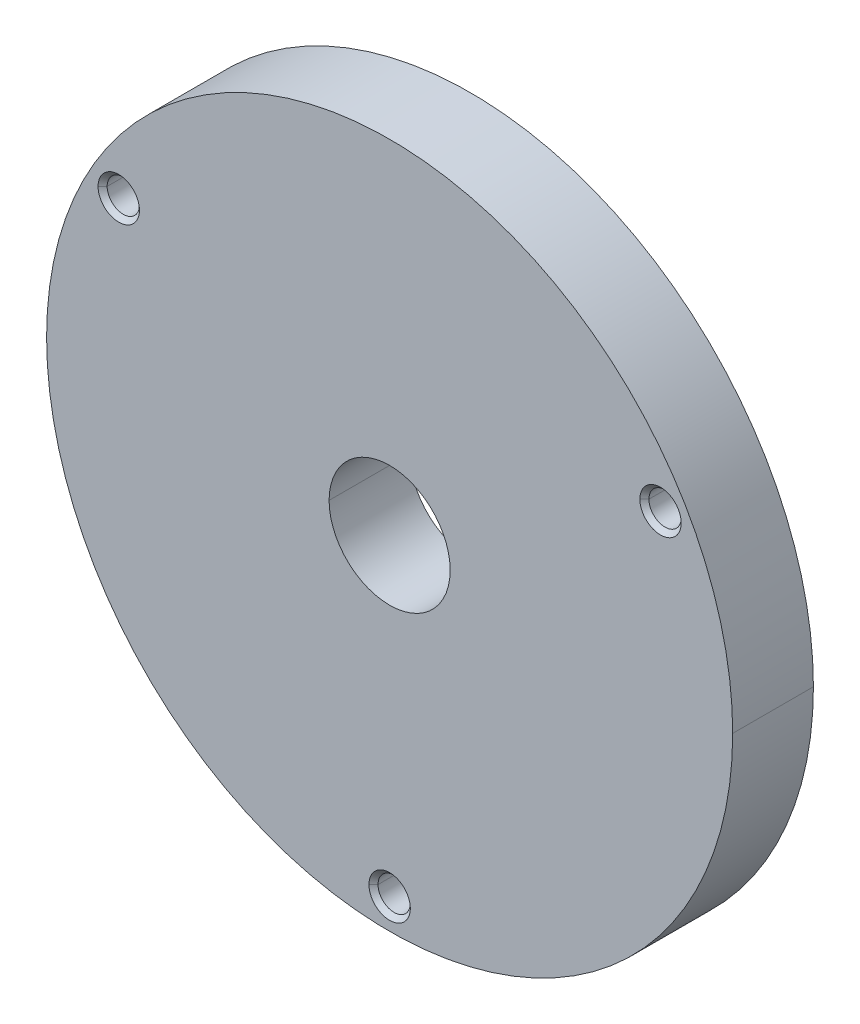
ISO-10303-21;
HEADER;
FILE_DESCRIPTION(('STEP AP214'),'2;1');
FILE_NAME('part.step','',(''),(''),'','','');
FILE_SCHEMA(('AUTOMOTIVE_DESIGN { 1 0 10303 214 1 1 1 1 }'));
ENDSEC;
DATA;
#1=APPLICATION_CONTEXT('core data for automotive mechanical design processes');
#2=APPLICATION_PROTOCOL_DEFINITION('international standard','automotive_design',2000,#1);
#3=PRODUCT_CONTEXT('',#1,'mechanical');
#4=PRODUCT('Part','Part','',(#3));
#5=PRODUCT_RELATED_PRODUCT_CATEGORY('part','',(#4));
#6=PRODUCT_DEFINITION_FORMATION('','',#4);
#7=PRODUCT_DEFINITION_CONTEXT('part definition',#1,'design');
#8=PRODUCT_DEFINITION('design','',#6,#7);
#9=PRODUCT_DEFINITION_SHAPE('','',#8);
#10=(LENGTH_UNIT() NAMED_UNIT(*) SI_UNIT(.MILLI.,.METRE.));
#11=(NAMED_UNIT(*) PLANE_ANGLE_UNIT() SI_UNIT($,.RADIAN.));
#12=(NAMED_UNIT(*) SI_UNIT($,.STERADIAN.) SOLID_ANGLE_UNIT());
#13=UNCERTAINTY_MEASURE_WITH_UNIT(LENGTH_MEASURE(1.E-05),#10,'distance_accuracy_value','');
#14=(GEOMETRIC_REPRESENTATION_CONTEXT(3) GLOBAL_UNCERTAINTY_ASSIGNED_CONTEXT((#13)) GLOBAL_UNIT_ASSIGNED_CONTEXT((#10,
#11,#12)) REPRESENTATION_CONTEXT('',''));
#15=CARTESIAN_POINT('',(0.,0.,0.));
#16=DIRECTION('',(0.,0.,1.));
#17=DIRECTION('',(1.,0.,0.));
#18=AXIS2_PLACEMENT_3D('',#15,#16,#17);
#19=CARTESIAN_POINT('',(0.,0.,-4.));
#20=DIRECTION('',(0.,0.,1.));
#21=DIRECTION('',(1.,0.,0.));
#22=AXIS2_PLACEMENT_3D('',#19,#20,#21);
#23=CYLINDRICAL_SURFACE('',#22,3.);
#24=DIRECTION('',(0.,0.,1.));
#25=VECTOR('',#24,1.);
#26=CARTESIAN_POINT('',(-3.,0.,-4.));
#27=LINE('',#26,#25);
#28=CARTESIAN_POINT('',(-3.,0.,-4.));
#29=VERTEX_POINT('',#28);
#30=CARTESIAN_POINT('',(-3.,0.,0.));
#31=VERTEX_POINT('',#30);
#32=EDGE_CURVE('E228',#29,#31,#27,.T.);
#33=ORIENTED_EDGE('',*,*,#32,.F.);
#34=CARTESIAN_POINT('',(0.,0.,-4.));
#35=DIRECTION('',(0.,0.,1.));
#36=DIRECTION('',(1.,0.,0.));
#37=AXIS2_PLACEMENT_3D('',#34,#35,#36);
#38=CIRCLE('',#37,3.);
#39=CARTESIAN_POINT('',(3.,0.,-4.));
#40=VERTEX_POINT('',#39);
#41=EDGE_CURVE('E82',#40,#29,#38,.T.);
#42=ORIENTED_EDGE('',*,*,#41,.F.);
#43=DIRECTION('',(0.,0.,1.));
#44=VECTOR('',#43,1.);
#45=CARTESIAN_POINT('',(3.,0.,-4.));
#46=LINE('',#45,#44);
#47=CARTESIAN_POINT('',(3.,0.,0.));
#48=VERTEX_POINT('',#47);
#49=EDGE_CURVE('E204',#40,#48,#46,.T.);
#50=ORIENTED_EDGE('',*,*,#49,.T.);
#51=CARTESIAN_POINT('',(0.,0.,0.));
#52=DIRECTION('',(0.,0.,1.));
#53=DIRECTION('',(1.,0.,0.));
#54=AXIS2_PLACEMENT_3D('',#51,#52,#53);
#55=CIRCLE('',#54,3.);
#56=EDGE_CURVE('E171',#48,#31,#55,.T.);
#57=ORIENTED_EDGE('',*,*,#56,.T.);
#58=EDGE_LOOP('',(#33,#42,#50,#57));
#59=FACE_BOUND('',#58,.T.);
#60=ADVANCED_FACE('F17',(#59),#23,.F.);
#61=CARTESIAN_POINT('',(-13.4233937586589,7.74999999999987,0.));
#62=DIRECTION('',(0.,0.,1.));
#63=DIRECTION('',(1.,0.,0.));
#64=AXIS2_PLACEMENT_3D('',#61,#62,#63);
#65=CONICAL_SURFACE('',#64,1.025,0.785398163397446);
#66=DIRECTION('',(-0.707106781186546,0.,0.707106781186549));
#67=VECTOR('',#66,1.);
#68=CARTESIAN_POINT('',(-14.4483937586589,7.74999999999987,0.));
#69=LINE('',#68,#67);
#70=CARTESIAN_POINT('',(-14.2233937586589,7.74999999999987,-0.225));
#71=VERTEX_POINT('',#70);
#72=CARTESIAN_POINT('',(-14.4483937586589,7.74999999999987,0.));
#73=VERTEX_POINT('',#72);
#74=EDGE_CURVE('E194',#71,#73,#69,.T.);
#75=ORIENTED_EDGE('',*,*,#74,.F.);
#76=CARTESIAN_POINT('',(-13.4233937586589,7.74999999999987,-0.225));
#77=DIRECTION('',(0.,0.,1.));
#78=DIRECTION('',(1.,0.,0.));
#79=AXIS2_PLACEMENT_3D('',#76,#77,#78);
#80=CIRCLE('',#79,0.8);
#81=CARTESIAN_POINT('',(-12.6233937586589,7.74999999999987,-0.225));
#82=VERTEX_POINT('',#81);
#83=EDGE_CURVE('E11',#82,#71,#80,.T.);
#84=ORIENTED_EDGE('',*,*,#83,.F.);
#85=DIRECTION('',(0.707106781186546,0.,0.707106781186549));
#86=VECTOR('',#85,1.);
#87=CARTESIAN_POINT('',(-12.3983937586589,7.74999999999987,0.));
#88=LINE('',#87,#86);
#89=CARTESIAN_POINT('',(-12.3983937586589,7.74999999999987,0.));
#90=VERTEX_POINT('',#89);
#91=EDGE_CURVE('E202',#82,#90,#88,.T.);
#92=ORIENTED_EDGE('',*,*,#91,.T.);
#93=CARTESIAN_POINT('',(-13.4233937586589,7.74999999999987,0.));
#94=DIRECTION('',(0.,0.,1.));
#95=DIRECTION('',(1.,0.,0.));
#96=AXIS2_PLACEMENT_3D('',#93,#94,#95);
#97=CIRCLE('',#96,1.025);
#98=EDGE_CURVE('E160',#90,#73,#97,.T.);
#99=ORIENTED_EDGE('',*,*,#98,.T.);
#100=EDGE_LOOP('',(#75,#84,#92,#99));
#101=FACE_BOUND('',#100,.T.);
#102=ADVANCED_FACE('F195',(#101),#65,.F.);
#103=CARTESIAN_POINT('',(-13.4233937586589,7.74999999999987,0.));
#104=DIRECTION('',(0.,0.,1.));
#105=DIRECTION('',(1.,0.,0.));
#106=AXIS2_PLACEMENT_3D('',#103,#104,#105);
#107=CYLINDRICAL_SURFACE('',#106,0.8);
#108=DIRECTION('',(0.,0.,1.));
#109=VECTOR('',#108,1.);
#110=CARTESIAN_POINT('',(-14.2233937586589,7.74999999999987,0.));
#111=LINE('',#110,#109);
#112=CARTESIAN_POINT('',(-14.2233937586589,7.74999999999987,-4.));
#113=VERTEX_POINT('',#112);
#114=EDGE_CURVE('E178',#113,#71,#111,.T.);
#115=ORIENTED_EDGE('',*,*,#114,.F.);
#116=CARTESIAN_POINT('',(-13.4233937586589,7.74999999999987,-4.));
#117=DIRECTION('',(0.,0.,1.));
#118=DIRECTION('',(1.,0.,0.));
#119=AXIS2_PLACEMENT_3D('',#116,#117,#118);
#120=CIRCLE('',#119,0.799999999999987);
#121=CARTESIAN_POINT('',(-12.6233937586589,7.74999999999987,-4.));
#122=VERTEX_POINT('',#121);
#123=EDGE_CURVE('E148',#122,#113,#120,.T.);
#124=ORIENTED_EDGE('',*,*,#123,.F.);
#125=DIRECTION('',(0.,0.,1.));
#126=VECTOR('',#125,1.);
#127=CARTESIAN_POINT('',(-12.6233937586589,7.74999999999987,0.));
#128=LINE('',#127,#126);
#129=EDGE_CURVE('E181',#122,#82,#128,.T.);
#130=ORIENTED_EDGE('',*,*,#129,.T.);
#131=ORIENTED_EDGE('',*,*,#83,.T.);
#132=EDGE_LOOP('',(#115,#124,#130,#131));
#133=FACE_BOUND('',#132,.T.);
#134=ADVANCED_FACE('F19',(#133),#107,.F.);
#135=CARTESIAN_POINT('',(13.4233937586588,7.75,0.));
#136=DIRECTION('',(0.,0.,1.));
#137=DIRECTION('',(1.,0.,0.));
#138=AXIS2_PLACEMENT_3D('',#135,#136,#137);
#139=CONICAL_SURFACE('',#138,1.025,0.785398163397446);
#140=DIRECTION('',(-0.707106781186546,0.,0.707106781186549));
#141=VECTOR('',#140,1.);
#142=CARTESIAN_POINT('',(12.3983937586588,7.75,0.));
#143=LINE('',#142,#141);
#144=CARTESIAN_POINT('',(12.6233937586588,7.75,-0.225));
#145=VERTEX_POINT('',#144);
#146=CARTESIAN_POINT('',(12.3983937586588,7.75,0.));
#147=VERTEX_POINT('',#146);
#148=EDGE_CURVE('E227',#145,#147,#143,.T.);
#149=ORIENTED_EDGE('',*,*,#148,.F.);
#150=CARTESIAN_POINT('',(13.4233937586588,7.75,-0.225));
#151=DIRECTION('',(0.,0.,1.));
#152=DIRECTION('',(1.,0.,0.));
#153=AXIS2_PLACEMENT_3D('',#150,#151,#152);
#154=CIRCLE('',#153,0.8);
#155=CARTESIAN_POINT('',(14.2233937586588,7.75,-0.225));
#156=VERTEX_POINT('',#155);
#157=EDGE_CURVE('E21',#156,#145,#154,.T.);
#158=ORIENTED_EDGE('',*,*,#157,.F.);
#159=DIRECTION('',(0.707106781186546,0.,0.707106781186549));
#160=VECTOR('',#159,1.);
#161=CARTESIAN_POINT('',(14.4483937586588,7.75,0.));
#162=LINE('',#161,#160);
#163=CARTESIAN_POINT('',(14.4483937586588,7.75,0.));
#164=VERTEX_POINT('',#163);
#165=EDGE_CURVE('E226',#156,#164,#162,.T.);
#166=ORIENTED_EDGE('',*,*,#165,.T.);
#167=CARTESIAN_POINT('',(13.4233937586588,7.75,0.));
#168=DIRECTION('',(0.,0.,1.));
#169=DIRECTION('',(1.,0.,0.));
#170=AXIS2_PLACEMENT_3D('',#167,#168,#169);
#171=CIRCLE('',#170,1.025);
#172=EDGE_CURVE('E218',#164,#147,#171,.T.);
#173=ORIENTED_EDGE('',*,*,#172,.T.);
#174=EDGE_LOOP('',(#149,#158,#166,#173));
#175=FACE_BOUND('',#174,.T.);
#176=ADVANCED_FACE('F334',(#175),#139,.F.);
#177=CARTESIAN_POINT('',(13.4233937586588,7.75,0.));
#178=DIRECTION('',(0.,0.,1.));
#179=DIRECTION('',(1.,0.,0.));
#180=AXIS2_PLACEMENT_3D('',#177,#178,#179);
#181=CYLINDRICAL_SURFACE('',#180,0.8);
#182=DIRECTION('',(0.,0.,1.));
#183=VECTOR('',#182,1.);
#184=CARTESIAN_POINT('',(12.6233937586588,7.75,0.));
#185=LINE('',#184,#183);
#186=CARTESIAN_POINT('',(12.6233937586588,7.75,-4.));
#187=VERTEX_POINT('',#186);
#188=EDGE_CURVE('E233',#187,#145,#185,.T.);
#189=ORIENTED_EDGE('',*,*,#188,.F.);
#190=CARTESIAN_POINT('',(13.4233937586588,7.75,-4.));
#191=DIRECTION('',(0.,0.,1.));
#192=DIRECTION('',(1.,0.,0.));
#193=AXIS2_PLACEMENT_3D('',#190,#191,#192);
#194=CIRCLE('',#193,0.799999999999987);
#195=CARTESIAN_POINT('',(14.2233937586587,7.75,-4.));
#196=VERTEX_POINT('',#195);
#197=EDGE_CURVE('E129',#196,#187,#194,.T.);
#198=ORIENTED_EDGE('',*,*,#197,.F.);
#199=DIRECTION('',(0.,0.,1.));
#200=VECTOR('',#199,1.);
#201=CARTESIAN_POINT('',(14.2233937586588,7.75,0.));
#202=LINE('',#201,#200);
#203=EDGE_CURVE('E237',#196,#156,#202,.T.);
#204=ORIENTED_EDGE('',*,*,#203,.T.);
#205=ORIENTED_EDGE('',*,*,#157,.T.);
#206=EDGE_LOOP('',(#189,#198,#204,#205));
#207=FACE_BOUND('',#206,.T.);
#208=ADVANCED_FACE('F328',(#207),#181,.F.);
#209=CARTESIAN_POINT('',(0.,-15.5,0.));
#210=DIRECTION('',(0.,0.,1.));
#211=DIRECTION('',(1.,0.,0.));
#212=AXIS2_PLACEMENT_3D('',#209,#210,#211);
#213=CONICAL_SURFACE('',#212,1.025,0.785398163397445);
#214=DIRECTION('',(-0.707106781186545,0.,0.70710678118655));
#215=VECTOR('',#214,1.);
#216=CARTESIAN_POINT('',(-1.025,-15.5,0.));
#217=LINE('',#216,#215);
#218=CARTESIAN_POINT('',(-0.8,-15.5,-0.225));
#219=VERTEX_POINT('',#218);
#220=CARTESIAN_POINT('',(-1.025,-15.5,0.));
#221=VERTEX_POINT('',#220);
#222=EDGE_CURVE('E244',#219,#221,#217,.T.);
#223=ORIENTED_EDGE('',*,*,#222,.F.);
#224=CARTESIAN_POINT('',(0.,-15.5,-0.225));
#225=DIRECTION('',(0.,0.,1.));
#226=DIRECTION('',(1.,0.,0.));
#227=AXIS2_PLACEMENT_3D('',#224,#225,#226);
#228=CIRCLE('',#227,0.8);
#229=CARTESIAN_POINT('',(0.8,-15.5,-0.225));
#230=VERTEX_POINT('',#229);
#231=EDGE_CURVE('E257',#230,#219,#228,.T.);
#232=ORIENTED_EDGE('',*,*,#231,.F.);
#233=DIRECTION('',(0.707106781186545,0.,0.70710678118655));
#234=VECTOR('',#233,1.);
#235=CARTESIAN_POINT('',(1.025,-15.5,0.));
#236=LINE('',#235,#234);
#237=CARTESIAN_POINT('',(1.025,-15.5,0.));
#238=VERTEX_POINT('',#237);
#239=EDGE_CURVE('E243',#230,#238,#236,.T.);
#240=ORIENTED_EDGE('',*,*,#239,.T.);
#241=CARTESIAN_POINT('',(0.,-15.5,0.));
#242=DIRECTION('',(0.,0.,1.));
#243=DIRECTION('',(1.,0.,0.));
#244=AXIS2_PLACEMENT_3D('',#241,#242,#243);
#245=CIRCLE('',#244,1.025);
#246=EDGE_CURVE('E221',#238,#221,#245,.T.);
#247=ORIENTED_EDGE('',*,*,#246,.T.);
#248=EDGE_LOOP('',(#223,#232,#240,#247));
#249=FACE_BOUND('',#248,.T.);
#250=ADVANCED_FACE('F359',(#249),#213,.F.);
#251=CARTESIAN_POINT('',(0.,-15.5,0.));
#252=DIRECTION('',(0.,0.,1.));
#253=DIRECTION('',(1.,0.,0.));
#254=AXIS2_PLACEMENT_3D('',#251,#252,#253);
#255=CYLINDRICAL_SURFACE('',#254,0.8);
#256=DIRECTION('',(0.,0.,1.));
#257=VECTOR('',#256,1.);
#258=CARTESIAN_POINT('',(-0.799999999999991,-15.5,0.));
#259=LINE('',#258,#257);
#260=CARTESIAN_POINT('',(-0.799999999999985,-15.5,-4.));
#261=VERTEX_POINT('',#260);
#262=EDGE_CURVE('E267',#261,#219,#259,.T.);
#263=ORIENTED_EDGE('',*,*,#262,.F.);
#264=CARTESIAN_POINT('',(0.,-15.5,-4.));
#265=DIRECTION('',(0.,0.,1.));
#266=DIRECTION('',(1.,0.,0.));
#267=AXIS2_PLACEMENT_3D('',#264,#265,#266);
#268=CIRCLE('',#267,0.799999999999987);
#269=CARTESIAN_POINT('',(0.799999999999989,-15.5,-4.));
#270=VERTEX_POINT('',#269);
#271=EDGE_CURVE('E217',#270,#261,#268,.T.);
#272=ORIENTED_EDGE('',*,*,#271,.F.);
#273=DIRECTION('',(0.,0.,1.));
#274=VECTOR('',#273,1.);
#275=CARTESIAN_POINT('',(0.8,-15.5,0.));
#276=LINE('',#275,#274);
#277=EDGE_CURVE('E268',#270,#230,#276,.T.);
#278=ORIENTED_EDGE('',*,*,#277,.T.);
#279=ORIENTED_EDGE('',*,*,#231,.T.);
#280=EDGE_LOOP('',(#263,#272,#278,#279));
#281=FACE_BOUND('',#280,.T.);
#282=ADVANCED_FACE('F348',(#281),#255,.F.);
#283=CARTESIAN_POINT('',(0.,0.,0.));
#284=DIRECTION('',(0.,0.,1.));
#285=DIRECTION('',(1.,0.,0.));
#286=AXIS2_PLACEMENT_3D('',#283,#284,#285);
#287=PLANE('',#286);
#288=ORIENTED_EDGE('',*,*,#246,.F.);
#289=CARTESIAN_POINT('',(0.,-15.5,0.));
#290=DIRECTION('',(0.,0.,1.));
#291=DIRECTION('',(1.,0.,0.));
#292=AXIS2_PLACEMENT_3D('',#289,#290,#291);
#293=CIRCLE('',#292,1.025);
#294=EDGE_CURVE('E239',#221,#238,#293,.T.);
#295=ORIENTED_EDGE('',*,*,#294,.F.);
#296=EDGE_LOOP('',(#288,#295));
#297=FACE_BOUND('',#296,.T.);
#298=ORIENTED_EDGE('',*,*,#172,.F.);
#299=CARTESIAN_POINT('',(13.4233937586588,7.75,0.));
#300=DIRECTION('',(0.,0.,1.));
#301=DIRECTION('',(1.,0.,0.));
#302=AXIS2_PLACEMENT_3D('',#299,#300,#301);
#303=CIRCLE('',#302,1.025);
#304=EDGE_CURVE('E222',#147,#164,#303,.T.);
#305=ORIENTED_EDGE('',*,*,#304,.F.);
#306=EDGE_LOOP('',(#298,#305));
#307=FACE_BOUND('',#306,.T.);
#308=ORIENTED_EDGE('',*,*,#98,.F.);
#309=CARTESIAN_POINT('',(-13.4233937586589,7.74999999999987,0.));
#310=DIRECTION('',(0.,0.,1.));
#311=DIRECTION('',(1.,0.,0.));
#312=AXIS2_PLACEMENT_3D('',#309,#310,#311);
#313=CIRCLE('',#312,1.025);
#314=EDGE_CURVE('E199',#73,#90,#313,.T.);
#315=ORIENTED_EDGE('',*,*,#314,.F.);
#316=EDGE_LOOP('',(#308,#315));
#317=FACE_BOUND('',#316,.T.);
#318=ORIENTED_EDGE('',*,*,#56,.F.);
#319=CARTESIAN_POINT('',(0.,0.,0.));
#320=DIRECTION('',(0.,0.,1.));
#321=DIRECTION('',(1.,0.,0.));
#322=AXIS2_PLACEMENT_3D('',#319,#320,#321);
#323=CIRCLE('',#322,3.);
#324=EDGE_CURVE('E211',#31,#48,#323,.T.);
#325=ORIENTED_EDGE('',*,*,#324,.F.);
#326=EDGE_LOOP('',(#318,#325));
#327=FACE_BOUND('',#326,.T.);
#328=CARTESIAN_POINT('',(0.,0.,0.));
#329=DIRECTION('',(0.,0.,1.));
#330=DIRECTION('',(1.,0.,0.));
#331=AXIS2_PLACEMENT_3D('',#328,#329,#330);
#332=CIRCLE('',#331,17.);
#333=CARTESIAN_POINT('',(17.,0.,0.));
#334=VERTEX_POINT('',#333);
#335=CARTESIAN_POINT('',(-17.,0.,0.));
#336=VERTEX_POINT('',#335);
#337=EDGE_CURVE('E275',#334,#336,#332,.T.);
#338=ORIENTED_EDGE('',*,*,#337,.T.);
#339=CARTESIAN_POINT('',(0.,0.,0.));
#340=DIRECTION('',(0.,0.,1.));
#341=DIRECTION('',(1.,0.,0.));
#342=AXIS2_PLACEMENT_3D('',#339,#340,#341);
#343=CIRCLE('',#342,17.);
#344=EDGE_CURVE('E41',#336,#334,#343,.T.);
#345=ORIENTED_EDGE('',*,*,#344,.T.);
#346=EDGE_LOOP('',(#338,#345));
#347=FACE_BOUND('',#346,.T.);
#348=ADVANCED_FACE('F343',(#297,#307,#317,#327,#347),#287,.T.);
#349=CARTESIAN_POINT('',(0.,0.,-4.));
#350=DIRECTION('',(0.,0.,1.));
#351=DIRECTION('',(1.,0.,0.));
#352=AXIS2_PLACEMENT_3D('',#349,#350,#351);
#353=PLANE('',#352);
#354=ORIENTED_EDGE('',*,*,#271,.T.);
#355=CARTESIAN_POINT('',(0.,-15.5,-4.));
#356=DIRECTION('',(0.,0.,1.));
#357=DIRECTION('',(1.,0.,0.));
#358=AXIS2_PLACEMENT_3D('',#355,#356,#357);
#359=CIRCLE('',#358,0.799999999999987);
#360=EDGE_CURVE('E263',#261,#270,#359,.T.);
#361=ORIENTED_EDGE('',*,*,#360,.T.);
#362=EDGE_LOOP('',(#354,#361));
#363=FACE_BOUND('',#362,.T.);
#364=ORIENTED_EDGE('',*,*,#197,.T.);
#365=CARTESIAN_POINT('',(13.4233937586588,7.75,-4.));
#366=DIRECTION('',(0.,0.,1.));
#367=DIRECTION('',(1.,0.,0.));
#368=AXIS2_PLACEMENT_3D('',#365,#366,#367);
#369=CIRCLE('',#368,0.799999999999987);
#370=EDGE_CURVE('E238',#187,#196,#369,.T.);
#371=ORIENTED_EDGE('',*,*,#370,.T.);
#372=EDGE_LOOP('',(#364,#371));
#373=FACE_BOUND('',#372,.T.);
#374=ORIENTED_EDGE('',*,*,#123,.T.);
#375=CARTESIAN_POINT('',(-13.4233937586589,7.74999999999987,-4.));
#376=DIRECTION('',(0.,0.,1.));
#377=DIRECTION('',(1.,0.,0.));
#378=AXIS2_PLACEMENT_3D('',#375,#376,#377);
#379=CIRCLE('',#378,0.799999999999987);
#380=EDGE_CURVE('E190',#113,#122,#379,.T.);
#381=ORIENTED_EDGE('',*,*,#380,.T.);
#382=EDGE_LOOP('',(#374,#381));
#383=FACE_BOUND('',#382,.T.);
#384=ORIENTED_EDGE('',*,*,#41,.T.);
#385=CARTESIAN_POINT('',(0.,0.,-4.));
#386=DIRECTION('',(0.,0.,1.));
#387=DIRECTION('',(1.,0.,0.));
#388=AXIS2_PLACEMENT_3D('',#385,#386,#387);
#389=CIRCLE('',#388,3.);
#390=EDGE_CURVE('E231',#29,#40,#389,.T.);
#391=ORIENTED_EDGE('',*,*,#390,.T.);
#392=EDGE_LOOP('',(#384,#391));
#393=FACE_BOUND('',#392,.T.);
#394=CARTESIAN_POINT('',(0.,0.,-4.));
#395=DIRECTION('',(0.,0.,1.));
#396=DIRECTION('',(1.,0.,0.));
#397=AXIS2_PLACEMENT_3D('',#394,#395,#396);
#398=CIRCLE('',#397,17.);
#399=CARTESIAN_POINT('',(17.,0.,-4.));
#400=VERTEX_POINT('',#399);
#401=CARTESIAN_POINT('',(-17.,0.,-4.));
#402=VERTEX_POINT('',#401);
#403=EDGE_CURVE('E272',#400,#402,#398,.T.);
#404=ORIENTED_EDGE('',*,*,#403,.F.);
#405=CARTESIAN_POINT('',(0.,0.,-4.));
#406=DIRECTION('',(0.,0.,1.));
#407=DIRECTION('',(1.,0.,0.));
#408=AXIS2_PLACEMENT_3D('',#405,#406,#407);
#409=CIRCLE('',#408,17.);
#410=EDGE_CURVE('E247',#402,#400,#409,.T.);
#411=ORIENTED_EDGE('',*,*,#410,.F.);
#412=EDGE_LOOP('',(#404,#411));
#413=FACE_BOUND('',#412,.T.);
#414=ADVANCED_FACE('F322',(#363,#373,#383,#393,#413),#353,.F.);
#415=CARTESIAN_POINT('',(0.,0.,-4.));
#416=DIRECTION('',(0.,0.,1.));
#417=DIRECTION('',(1.,0.,0.));
#418=AXIS2_PLACEMENT_3D('',#415,#416,#417);
#419=CYLINDRICAL_SURFACE('',#418,17.);
#420=DIRECTION('',(0.,0.,1.));
#421=VECTOR('',#420,1.);
#422=CARTESIAN_POINT('',(-17.,0.,-4.));
#423=LINE('',#422,#421);
#424=EDGE_CURVE('E281',#402,#336,#423,.T.);
#425=ORIENTED_EDGE('',*,*,#424,.F.);
#426=ORIENTED_EDGE('',*,*,#410,.T.);
#427=DIRECTION('',(0.,0.,1.));
#428=VECTOR('',#427,1.);
#429=CARTESIAN_POINT('',(17.,0.,-4.));
#430=LINE('',#429,#428);
#431=EDGE_CURVE('E250',#400,#334,#430,.T.);
#432=ORIENTED_EDGE('',*,*,#431,.T.);
#433=ORIENTED_EDGE('',*,*,#344,.F.);
#434=EDGE_LOOP('',(#425,#426,#432,#433));
#435=FACE_BOUND('',#434,.T.);
#436=ADVANCED_FACE('F378',(#435),#419,.T.);
#437=CARTESIAN_POINT('',(0.,0.,-4.));
#438=DIRECTION('',(0.,0.,1.));
#439=DIRECTION('',(1.,0.,0.));
#440=AXIS2_PLACEMENT_3D('',#437,#438,#439);
#441=CYLINDRICAL_SURFACE('',#440,17.);
#442=ORIENTED_EDGE('',*,*,#403,.T.);
#443=ORIENTED_EDGE('',*,*,#424,.T.);
#444=ORIENTED_EDGE('',*,*,#337,.F.);
#445=ORIENTED_EDGE('',*,*,#431,.F.);
#446=EDGE_LOOP('',(#442,#443,#444,#445));
#447=FACE_BOUND('',#446,.T.);
#448=ADVANCED_FACE('F372',(#447),#441,.T.);
#449=CARTESIAN_POINT('',(0.,-15.5,0.));
#450=DIRECTION('',(0.,0.,1.));
#451=DIRECTION('',(1.,0.,0.));
#452=AXIS2_PLACEMENT_3D('',#449,#450,#451);
#453=CYLINDRICAL_SURFACE('',#452,0.8);
#454=ORIENTED_EDGE('',*,*,#360,.F.);
#455=ORIENTED_EDGE('',*,*,#262,.T.);
#456=CARTESIAN_POINT('',(0.,-15.5,-0.225));
#457=DIRECTION('',(0.,0.,1.));
#458=DIRECTION('',(1.,0.,0.));
#459=AXIS2_PLACEMENT_3D('',#456,#457,#458);
#460=CIRCLE('',#459,0.8);
#461=EDGE_CURVE('E295',#219,#230,#460,.T.);
#462=ORIENTED_EDGE('',*,*,#461,.T.);
#463=ORIENTED_EDGE('',*,*,#277,.F.);
#464=EDGE_LOOP('',(#454,#455,#462,#463));
#465=FACE_BOUND('',#464,.T.);
#466=ADVANCED_FACE('F377',(#465),#453,.F.);
#467=CARTESIAN_POINT('',(0.,-15.5,0.));
#468=DIRECTION('',(0.,0.,1.));
#469=DIRECTION('',(1.,0.,0.));
#470=AXIS2_PLACEMENT_3D('',#467,#468,#469);
#471=CONICAL_SURFACE('',#470,1.025,0.785398163397445);
#472=ORIENTED_EDGE('',*,*,#461,.F.);
#473=ORIENTED_EDGE('',*,*,#222,.T.);
#474=ORIENTED_EDGE('',*,*,#294,.T.);
#475=ORIENTED_EDGE('',*,*,#239,.F.);
#476=EDGE_LOOP('',(#472,#473,#474,#475));
#477=FACE_BOUND('',#476,.T.);
#478=ADVANCED_FACE('F434',(#477),#471,.F.);
#479=CARTESIAN_POINT('',(13.4233937586588,7.75,0.));
#480=DIRECTION('',(0.,0.,1.));
#481=DIRECTION('',(1.,0.,0.));
#482=AXIS2_PLACEMENT_3D('',#479,#480,#481);
#483=CYLINDRICAL_SURFACE('',#482,0.8);
#484=ORIENTED_EDGE('',*,*,#370,.F.);
#485=ORIENTED_EDGE('',*,*,#188,.T.);
#486=CARTESIAN_POINT('',(13.4233937586588,7.75,-0.225));
#487=DIRECTION('',(0.,0.,1.));
#488=DIRECTION('',(1.,0.,0.));
#489=AXIS2_PLACEMENT_3D('',#486,#487,#488);
#490=CIRCLE('',#489,0.8);
#491=EDGE_CURVE('E284',#145,#156,#490,.T.);
#492=ORIENTED_EDGE('',*,*,#491,.T.);
#493=ORIENTED_EDGE('',*,*,#203,.F.);
#494=EDGE_LOOP('',(#484,#485,#492,#493));
#495=FACE_BOUND('',#494,.T.);
#496=ADVANCED_FACE('F324',(#495),#483,.F.);
#497=CARTESIAN_POINT('',(13.4233937586588,7.75,0.));
#498=DIRECTION('',(0.,0.,1.));
#499=DIRECTION('',(1.,0.,0.));
#500=AXIS2_PLACEMENT_3D('',#497,#498,#499);
#501=CONICAL_SURFACE('',#500,1.025,0.785398163397446);
#502=ORIENTED_EDGE('',*,*,#491,.F.);
#503=ORIENTED_EDGE('',*,*,#148,.T.);
#504=ORIENTED_EDGE('',*,*,#304,.T.);
#505=ORIENTED_EDGE('',*,*,#165,.F.);
#506=EDGE_LOOP('',(#502,#503,#504,#505));
#507=FACE_BOUND('',#506,.T.);
#508=ADVANCED_FACE('F331',(#507),#501,.F.);
#509=CARTESIAN_POINT('',(-13.4233937586589,7.74999999999987,0.));
#510=DIRECTION('',(0.,0.,1.));
#511=DIRECTION('',(1.,0.,0.));
#512=AXIS2_PLACEMENT_3D('',#509,#510,#511);
#513=CYLINDRICAL_SURFACE('',#512,0.8);
#514=ORIENTED_EDGE('',*,*,#380,.F.);
#515=ORIENTED_EDGE('',*,*,#114,.T.);
#516=CARTESIAN_POINT('',(-13.4233937586589,7.74999999999987,-0.225));
#517=DIRECTION('',(0.,0.,1.));
#518=DIRECTION('',(1.,0.,0.));
#519=AXIS2_PLACEMENT_3D('',#516,#517,#518);
#520=CIRCLE('',#519,0.8);
#521=EDGE_CURVE('E189',#71,#82,#520,.T.);
#522=ORIENTED_EDGE('',*,*,#521,.T.);
#523=ORIENTED_EDGE('',*,*,#129,.F.);
#524=EDGE_LOOP('',(#514,#515,#522,#523));
#525=FACE_BOUND('',#524,.T.);
#526=ADVANCED_FACE('F187',(#525),#513,.F.);
#527=CARTESIAN_POINT('',(-13.4233937586589,7.74999999999987,0.));
#528=DIRECTION('',(0.,0.,1.));
#529=DIRECTION('',(1.,0.,0.));
#530=AXIS2_PLACEMENT_3D('',#527,#528,#529);
#531=CONICAL_SURFACE('',#530,1.025,0.785398163397446);
#532=ORIENTED_EDGE('',*,*,#521,.F.);
#533=ORIENTED_EDGE('',*,*,#74,.T.);
#534=ORIENTED_EDGE('',*,*,#314,.T.);
#535=ORIENTED_EDGE('',*,*,#91,.F.);
#536=EDGE_LOOP('',(#532,#533,#534,#535));
#537=FACE_BOUND('',#536,.T.);
#538=ADVANCED_FACE('F201',(#537),#531,.F.);
#539=CARTESIAN_POINT('',(0.,0.,-4.));
#540=DIRECTION('',(0.,0.,1.));
#541=DIRECTION('',(1.,0.,0.));
#542=AXIS2_PLACEMENT_3D('',#539,#540,#541);
#543=CYLINDRICAL_SURFACE('',#542,3.);
#544=ORIENTED_EDGE('',*,*,#390,.F.);
#545=ORIENTED_EDGE('',*,*,#32,.T.);
#546=ORIENTED_EDGE('',*,*,#324,.T.);
#547=ORIENTED_EDGE('',*,*,#49,.F.);
#548=EDGE_LOOP('',(#544,#545,#546,#547));
#549=FACE_BOUND('',#548,.T.);
#550=ADVANCED_FACE('F403',(#549),#543,.F.);
#551=CLOSED_SHELL('',(#60,#102,#134,#176,#208,#250,#282,#348,#414,#436,#448,#466,#478,#496,#508,
#526,#538,#550));
#552=MANIFOLD_SOLID_BREP('B1',#551);
#553=ADVANCED_BREP_SHAPE_REPRESENTATION('',(#18,#552),#14);
#554=SHAPE_DEFINITION_REPRESENTATION(#9,#553);
ENDSEC;
END-ISO-10303-21;
